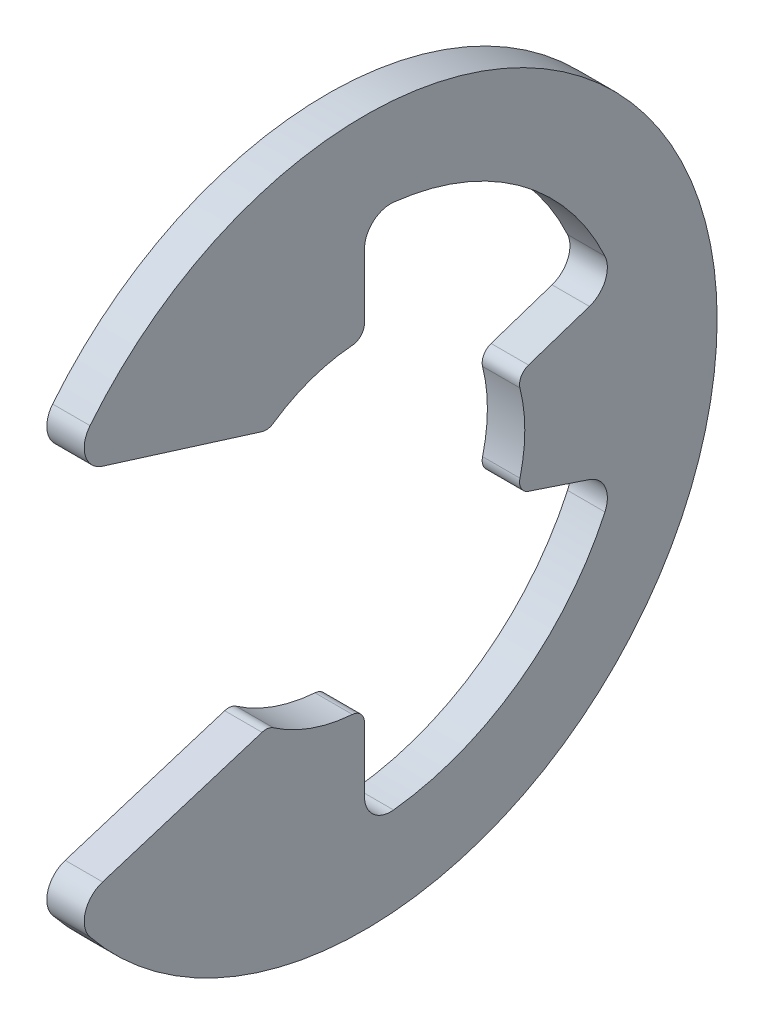
ISO-10303-21;
HEADER;
FILE_DESCRIPTION(('STEP AP214'),'2;1');
FILE_NAME('part.step','',(''),(''),'','','');
FILE_SCHEMA(('AUTOMOTIVE_DESIGN { 1 0 10303 214 1 1 1 1 }'));
ENDSEC;
DATA;
#1=APPLICATION_CONTEXT('core data for automotive mechanical design processes');
#2=APPLICATION_PROTOCOL_DEFINITION('international standard','automotive_design',2000,#1);
#3=PRODUCT_CONTEXT('',#1,'mechanical');
#4=PRODUCT('Part','Part','',(#3));
#5=PRODUCT_RELATED_PRODUCT_CATEGORY('part','',(#4));
#6=PRODUCT_DEFINITION_FORMATION('','',#4);
#7=PRODUCT_DEFINITION_CONTEXT('part definition',#1,'design');
#8=PRODUCT_DEFINITION('design','',#6,#7);
#9=PRODUCT_DEFINITION_SHAPE('','',#8);
#10=(LENGTH_UNIT() NAMED_UNIT(*) SI_UNIT(.MILLI.,.METRE.));
#11=(NAMED_UNIT(*) PLANE_ANGLE_UNIT() SI_UNIT($,.RADIAN.));
#12=(NAMED_UNIT(*) SI_UNIT($,.STERADIAN.) SOLID_ANGLE_UNIT());
#13=UNCERTAINTY_MEASURE_WITH_UNIT(LENGTH_MEASURE(1.E-05),#10,'distance_accuracy_value','');
#14=(GEOMETRIC_REPRESENTATION_CONTEXT(3) GLOBAL_UNCERTAINTY_ASSIGNED_CONTEXT((#13)) GLOBAL_UNIT_ASSIGNED_CONTEXT((#10,
#11,#12)) REPRESENTATION_CONTEXT('',''));
#15=CARTESIAN_POINT('',(0.,0.,0.));
#16=DIRECTION('',(0.,0.,1.));
#17=DIRECTION('',(1.,0.,0.));
#18=AXIS2_PLACEMENT_3D('',#15,#16,#17);
#19=CARTESIAN_POINT('',(0.444499999999999,0.,0.));
#20=DIRECTION('',(-1.,0.,0.));
#21=DIRECTION('',(0.,0.,1.));
#22=AXIS2_PLACEMENT_3D('',#19,#20,#21);
#23=CYLINDRICAL_SURFACE('',#22,3.81);
#24=CARTESIAN_POINT('',(0.444499999999999,0.,0.));
#25=DIRECTION('',(-1.,0.,0.));
#26=DIRECTION('',(0.,0.,-1.));
#27=AXIS2_PLACEMENT_3D('',#24,#25,#26);
#28=CIRCLE('',#27,3.81);
#29=CARTESIAN_POINT('',(0.444499999999999,0.928492622152132,-3.69513212897848));
#30=VERTEX_POINT('',#29);
#31=CARTESIAN_POINT('',(0.444499999999999,-0.928492622152131,-3.69513212897848));
#32=VERTEX_POINT('',#31);
#33=EDGE_CURVE('E246',#30,#32,#28,.T.);
#34=ORIENTED_EDGE('',*,*,#33,.F.);
#35=DIRECTION('',(-1.,0.,0.));
#36=VECTOR('',#35,1.);
#37=CARTESIAN_POINT('',(0.444499999999999,0.928492622152132,-3.69513212897848));
#38=LINE('',#37,#36);
#39=CARTESIAN_POINT('',(-0.444500000000001,0.928492622152132,-3.69513212897848));
#40=VERTEX_POINT('',#39);
#41=EDGE_CURVE('E360',#30,#40,#38,.T.);
#42=ORIENTED_EDGE('',*,*,#41,.T.);
#43=CARTESIAN_POINT('',(-0.444500000000001,0.,0.));
#44=DIRECTION('',(-1.,0.,0.));
#45=DIRECTION('',(0.,0.,-1.));
#46=AXIS2_PLACEMENT_3D('',#43,#44,#45);
#47=CIRCLE('',#46,3.81);
#48=CARTESIAN_POINT('',(-0.444500000000001,-0.928492622152131,-3.69513212897848));
#49=VERTEX_POINT('',#48);
#50=EDGE_CURVE('E419',#40,#49,#47,.T.);
#51=ORIENTED_EDGE('',*,*,#50,.T.);
#52=DIRECTION('',(-1.,0.,0.));
#53=VECTOR('',#52,1.);
#54=CARTESIAN_POINT('',(0.444499999999999,-0.928492622152131,-3.69513212897848));
#55=LINE('',#54,#53);
#56=EDGE_CURVE('E60',#49,#32,#55,.F.);
#57=ORIENTED_EDGE('',*,*,#56,.T.);
#58=EDGE_LOOP('',(#34,#42,#51,#57));
#59=FACE_BOUND('',#58,.T.);
#60=ADVANCED_FACE('F37',(#59),#23,.F.);
#61=CARTESIAN_POINT('',(0.444499999999999,-1.20482778852415,-3.61448336557246));
#62=DIRECTION('',(0.,0.948683298050514,-0.316227766016838));
#63=DIRECTION('',(0.,0.316227766016838,0.948683298050514));
#64=AXIS2_PLACEMENT_3D('',#61,#62,#63);
#65=PLANE('',#64);
#66=DIRECTION('',(0.,-0.316227766016838,-0.948683298050514));
#67=VECTOR('',#66,1.);
#68=CARTESIAN_POINT('',(0.444499999999999,-1.20482778852415,-3.61448336557246));
#69=LINE('',#68,#67);
#70=CARTESIAN_POINT('',(0.444499999999999,-1.29950232781631,-3.89850698344892));
#71=VERTEX_POINT('',#70);
#72=CARTESIAN_POINT('',(0.444499999999999,-1.78228945343254,-5.34686836029762));
#73=VERTEX_POINT('',#72);
#74=EDGE_CURVE('E248',#71,#73,#69,.T.);
#75=ORIENTED_EDGE('',*,*,#74,.F.);
#76=DIRECTION('',(-1.,0.,0.));
#77=VECTOR('',#76,1.);
#78=CARTESIAN_POINT('',(0.444499999999999,-1.29950232781631,-3.89850698344892));
#79=LINE('',#78,#77);
#80=CARTESIAN_POINT('',(-0.444500000000001,-1.29950232781631,-3.89850698344892));
#81=VERTEX_POINT('',#80);
#82=EDGE_CURVE('E365',#71,#81,#79,.T.);
#83=ORIENTED_EDGE('',*,*,#82,.T.);
#84=DIRECTION('',(0.,-0.316227766016838,-0.948683298050514));
#85=VECTOR('',#84,1.);
#86=CARTESIAN_POINT('',(-0.444500000000001,-1.20482778852415,-3.61448336557246));
#87=LINE('',#86,#85);
#88=CARTESIAN_POINT('',(-0.444500000000001,-1.78228945343254,-5.34686836029762));
#89=VERTEX_POINT('',#88);
#90=EDGE_CURVE('E421',#81,#89,#87,.T.);
#91=ORIENTED_EDGE('',*,*,#90,.T.);
#92=DIRECTION('',(1.,0.,0.));
#93=VECTOR('',#92,1.);
#94=CARTESIAN_POINT('',(0.444499999999999,-1.78228945343254,-5.34686836029762));
#95=LINE('',#94,#93);
#96=EDGE_CURVE('E294',#89,#73,#95,.T.);
#97=ORIENTED_EDGE('',*,*,#96,.T.);
#98=EDGE_LOOP('',(#75,#83,#91,#97));
#99=FACE_BOUND('',#98,.T.);
#100=ADVANCED_FACE('F457',(#99),#65,.F.);
#101=CARTESIAN_POINT('',(0.444499999999999,0.,0.));
#102=DIRECTION('',(-1.,0.,0.));
#103=DIRECTION('',(0.,0.,1.));
#104=AXIS2_PLACEMENT_3D('',#101,#102,#103);
#105=CYLINDRICAL_SURFACE('',#104,6.29264516129032);
#106=CARTESIAN_POINT('',(-0.444500000000001,0.,0.));
#107=DIRECTION('',(-1.,0.,0.));
#108=DIRECTION('',(0.,0.,-1.));
#109=AXIS2_PLACEMENT_3D('',#106,#107,#108);
#110=CIRCLE('',#109,6.29264516129032);
#111=CARTESIAN_POINT('',(-0.444500000000001,-2.63304543546507,-5.71528257050227));
#112=VERTEX_POINT('',#111);
#113=CARTESIAN_POINT('',(-0.444500000000001,-6.25463519415267,-0.690595188208944));
#114=VERTEX_POINT('',#113);
#115=EDGE_CURVE('E423',#112,#114,#110,.T.);
#116=ORIENTED_EDGE('',*,*,#115,.T.);
#117=DIRECTION('',(-1.,0.,0.));
#118=VECTOR('',#117,1.);
#119=CARTESIAN_POINT('',(0.444499999999999,-6.25463519415267,-0.690595188208944));
#120=LINE('',#119,#118);
#121=CARTESIAN_POINT('',(0.444499999999999,-6.25463519415267,-0.690595188208944));
#122=VERTEX_POINT('',#121);
#123=EDGE_CURVE('E292',#114,#122,#120,.F.);
#124=ORIENTED_EDGE('',*,*,#123,.T.);
#125=CARTESIAN_POINT('',(0.444499999999999,0.,0.));
#126=DIRECTION('',(-1.,0.,0.));
#127=DIRECTION('',(0.,0.,-1.));
#128=AXIS2_PLACEMENT_3D('',#125,#126,#127);
#129=CIRCLE('',#128,6.29264516129032);
#130=CARTESIAN_POINT('',(0.444499999999999,-2.63304543546507,-5.71528257050227));
#131=VERTEX_POINT('',#130);
#132=EDGE_CURVE('E250',#131,#122,#129,.T.);
#133=ORIENTED_EDGE('',*,*,#132,.F.);
#134=DIRECTION('',(-1.,0.,0.));
#135=VECTOR('',#134,1.);
#136=CARTESIAN_POINT('',(0.444499999999999,-2.63304543546507,-5.71528257050227));
#137=LINE('',#136,#135);
#138=EDGE_CURVE('E289',#131,#112,#137,.T.);
#139=ORIENTED_EDGE('',*,*,#138,.T.);
#140=EDGE_LOOP('',(#116,#124,#133,#139));
#141=FACE_BOUND('',#140,.T.);
#142=ADVANCED_FACE('F463',(#141),#105,.F.);
#143=CARTESIAN_POINT('',(0.444499999999999,-6.29264516129032,0.));
#144=DIRECTION('',(0.,0.,1.));
#145=DIRECTION('',(0.,-1.,0.));
#146=AXIS2_PLACEMENT_3D('',#143,#144,#145);
#147=PLANE('',#146);
#148=DIRECTION('',(0.,1.,0.));
#149=VECTOR('',#148,1.);
#150=CARTESIAN_POINT('',(-0.444500000000001,-6.29264516129032,0.));
#151=LINE('',#150,#149);
#152=CARTESIAN_POINT('',(-0.444500000000001,-5.63609412254343,0.));
#153=VERTEX_POINT('',#152);
#154=CARTESIAN_POINT('',(-0.444500000000001,-4.10938718059031,0.));
#155=VERTEX_POINT('',#154);
#156=EDGE_CURVE('E428',#153,#155,#151,.T.);
#157=ORIENTED_EDGE('',*,*,#156,.T.);
#158=DIRECTION('',(-1.,0.,0.));
#159=VECTOR('',#158,1.);
#160=CARTESIAN_POINT('',(0.444499999999999,-4.10938718059031,0.));
#161=LINE('',#160,#159);
#162=CARTESIAN_POINT('',(0.444499999999999,-4.10938718059031,0.));
#163=VERTEX_POINT('',#162);
#164=EDGE_CURVE('E343',#155,#163,#161,.F.);
#165=ORIENTED_EDGE('',*,*,#164,.T.);
#166=DIRECTION('',(0.,1.,0.));
#167=VECTOR('',#166,1.);
#168=CARTESIAN_POINT('',(0.444499999999999,-6.29264516129032,0.));
#169=LINE('',#168,#167);
#170=CARTESIAN_POINT('',(0.444499999999999,-5.63609412254343,0.));
#171=VERTEX_POINT('',#170);
#172=EDGE_CURVE('E253',#171,#163,#169,.T.);
#173=ORIENTED_EDGE('',*,*,#172,.F.);
#174=DIRECTION('',(1.,0.,0.));
#175=VECTOR('',#174,1.);
#176=CARTESIAN_POINT('',(-0.444500000000001,-5.63609412254343,0.));
#177=LINE('',#176,#175);
#178=EDGE_CURVE('E286',#171,#153,#177,.F.);
#179=ORIENTED_EDGE('',*,*,#178,.T.);
#180=EDGE_LOOP('',(#157,#165,#173,#179));
#181=FACE_BOUND('',#180,.T.);
#182=ADVANCED_FACE('F469',(#181),#147,.F.);
#183=CARTESIAN_POINT('',(0.444499999999999,0.,0.));
#184=DIRECTION('',(-1.,0.,0.));
#185=DIRECTION('',(0.,0.,1.));
#186=AXIS2_PLACEMENT_3D('',#183,#184,#185);
#187=CYLINDRICAL_SURFACE('',#186,3.81);
#188=CARTESIAN_POINT('',(0.444499999999999,0.,0.));
#189=DIRECTION('',(-1.,0.,0.));
#190=DIRECTION('',(0.,0.,-1.));
#191=AXIS2_PLACEMENT_3D('',#188,#189,#190);
#192=CIRCLE('',#191,3.81);
#193=CARTESIAN_POINT('',(0.444499999999999,-3.79912528251801,0.287657935285054));
#194=VERTEX_POINT('',#193);
#195=CARTESIAN_POINT('',(0.444499999999999,-3.1352778512518,2.16474774406856));
#196=VERTEX_POINT('',#195);
#197=EDGE_CURVE('E256',#194,#196,#192,.T.);
#198=ORIENTED_EDGE('',*,*,#197,.F.);
#199=DIRECTION('',(-1.,0.,0.));
#200=VECTOR('',#199,1.);
#201=CARTESIAN_POINT('',(0.444499999999999,-3.79912528251801,0.287657935285054));
#202=LINE('',#201,#200);
#203=CARTESIAN_POINT('',(-0.444500000000001,-3.79912528251801,0.287657935285054));
#204=VERTEX_POINT('',#203);
#205=EDGE_CURVE('E328',#194,#204,#202,.T.);
#206=ORIENTED_EDGE('',*,*,#205,.T.);
#207=CARTESIAN_POINT('',(-0.444500000000001,0.,0.));
#208=DIRECTION('',(-1.,0.,0.));
#209=DIRECTION('',(0.,0.,-1.));
#210=AXIS2_PLACEMENT_3D('',#207,#208,#209);
#211=CIRCLE('',#210,3.81);
#212=CARTESIAN_POINT('',(-0.444500000000001,-3.1352778512518,2.16474774406856));
#213=VERTEX_POINT('',#212);
#214=EDGE_CURVE('E232',#204,#213,#211,.T.);
#215=ORIENTED_EDGE('',*,*,#214,.T.);
#216=DIRECTION('',(-1.,0.,0.));
#217=VECTOR('',#216,1.);
#218=CARTESIAN_POINT('',(0.444499999999999,-3.1352778512518,2.16474774406856));
#219=LINE('',#218,#217);
#220=EDGE_CURVE('E326',#213,#196,#219,.F.);
#221=ORIENTED_EDGE('',*,*,#220,.T.);
#222=EDGE_LOOP('',(#198,#206,#215,#221));
#223=FACE_BOUND('',#222,.T.);
#224=ADVANCED_FACE('F434',(#223),#187,.F.);
#225=CARTESIAN_POINT('',(0.444499999999999,-3.048,2.286));
#226=DIRECTION('',(0.,-0.954513538836348,-0.29816757734219));
#227=DIRECTION('',(0.,0.29816757734219,-0.954513538836348));
#228=AXIS2_PLACEMENT_3D('',#225,#226,#227);
#229=PLANE('',#228);
#230=DIRECTION('',(0.,-0.29816757734219,0.954513538836348));
#231=VECTOR('',#230,1.);
#232=CARTESIAN_POINT('',(0.444499999999999,-3.048,2.286));
#233=LINE('',#232,#231);
#234=CARTESIAN_POINT('',(0.444499999999999,-3.09432865482843,2.43431031819085));
#235=VERTEX_POINT('',#234);
#236=CARTESIAN_POINT('',(0.444499999999999,-4.27839448098877,6.22481923944225));
#237=VERTEX_POINT('',#236);
#238=EDGE_CURVE('E259',#235,#237,#233,.T.);
#239=ORIENTED_EDGE('',*,*,#238,.F.);
#240=DIRECTION('',(-1.,0.,0.));
#241=VECTOR('',#240,1.);
#242=CARTESIAN_POINT('',(0.444499999999999,-3.09432865482843,2.43431031819085));
#243=LINE('',#242,#241);
#244=CARTESIAN_POINT('',(-0.444500000000001,-3.09432865482843,2.43431031819085));
#245=VERTEX_POINT('',#244);
#246=EDGE_CURVE('E356',#235,#245,#243,.T.);
#247=ORIENTED_EDGE('',*,*,#246,.T.);
#248=DIRECTION('',(0.,-0.29816757734219,0.954513538836348));
#249=VECTOR('',#248,1.);
#250=CARTESIAN_POINT('',(-0.444500000000001,-3.048,2.286));
#251=LINE('',#250,#249);
#252=CARTESIAN_POINT('',(-0.444500000000001,-4.27839448098877,6.22481923944225));
#253=VERTEX_POINT('',#252);
#254=EDGE_CURVE('E227',#245,#253,#251,.T.);
#255=ORIENTED_EDGE('',*,*,#254,.T.);
#256=DIRECTION('',(-1.,0.,0.));
#257=VECTOR('',#256,1.);
#258=CARTESIAN_POINT('',(0.444499999999999,-4.27839448098877,6.22481923944225));
#259=LINE('',#258,#257);
#260=EDGE_CURVE('E207',#253,#237,#259,.F.);
#261=ORIENTED_EDGE('',*,*,#260,.T.);
#262=EDGE_LOOP('',(#239,#247,#255,#261));
#263=FACE_BOUND('',#262,.T.);
#264=ADVANCED_FACE('F442',(#263),#229,.F.);
#265=CARTESIAN_POINT('',(0.444499999999999,0.,0.));
#266=DIRECTION('',(-1.,0.,0.));
#267=DIRECTION('',(0.,0.,1.));
#268=AXIS2_PLACEMENT_3D('',#265,#266,#267);
#269=CYLINDRICAL_SURFACE('',#268,8.382);
#270=CARTESIAN_POINT('',(0.444499999999999,0.,0.));
#271=DIRECTION('',(1.,0.,0.));
#272=DIRECTION('',(0.,0.,-1.));
#273=AXIS2_PLACEMENT_3D('',#270,#271,#272);
#274=CIRCLE('',#273,8.382);
#275=CARTESIAN_POINT('',(0.444499999999999,-5.2631362505669,6.52359722913429));
#276=VERTEX_POINT('',#275);
#277=CARTESIAN_POINT('',(0.444499999999999,5.2631362505669,6.5235972291343));
#278=VERTEX_POINT('',#277);
#279=EDGE_CURVE('E220',#276,#278,#274,.T.);
#280=ORIENTED_EDGE('',*,*,#279,.F.);
#281=DIRECTION('',(-1.,0.,0.));
#282=VECTOR('',#281,1.);
#283=CARTESIAN_POINT('',(0.444499999999999,-5.2631362505669,6.52359722913429));
#284=LINE('',#283,#282);
#285=CARTESIAN_POINT('',(-0.444500000000001,-5.2631362505669,6.52359722913429));
#286=VERTEX_POINT('',#285);
#287=EDGE_CURVE('E205',#276,#286,#284,.T.);
#288=ORIENTED_EDGE('',*,*,#287,.T.);
#289=CARTESIAN_POINT('',(-0.444500000000001,0.,0.));
#290=DIRECTION('',(1.,0.,0.));
#291=DIRECTION('',(0.,0.,-1.));
#292=AXIS2_PLACEMENT_3D('',#289,#290,#291);
#293=CIRCLE('',#292,8.382);
#294=CARTESIAN_POINT('',(-0.444500000000001,5.2631362505669,6.5235972291343));
#295=VERTEX_POINT('',#294);
#296=EDGE_CURVE('E217',#286,#295,#293,.T.);
#297=ORIENTED_EDGE('',*,*,#296,.T.);
#298=DIRECTION('',(-1.,0.,0.));
#299=VECTOR('',#298,1.);
#300=CARTESIAN_POINT('',(0.444499999999999,5.2631362505669,6.52359722913429));
#301=LINE('',#300,#299);
#302=EDGE_CURVE('E221',#295,#278,#301,.F.);
#303=ORIENTED_EDGE('',*,*,#302,.T.);
#304=EDGE_LOOP('',(#280,#288,#297,#303));
#305=FACE_BOUND('',#304,.T.);
#306=ADVANCED_FACE('F216',(#305),#269,.T.);
#307=CARTESIAN_POINT('',(0.444499999999999,4.5357679010237,7.04873985532471));
#308=DIRECTION('',(0.,0.954513538836348,-0.29816757734219));
#309=DIRECTION('',(0.,0.29816757734219,0.954513538836348));
#310=AXIS2_PLACEMENT_3D('',#307,#308,#309);
#311=PLANE('',#310);
#312=DIRECTION('',(0.,-0.29816757734219,-0.954513538836348));
#313=VECTOR('',#312,1.);
#314=CARTESIAN_POINT('',(-0.444500000000001,4.5357679010237,7.04873985532471));
#315=LINE('',#314,#313);
#316=CARTESIAN_POINT('',(-0.444500000000001,4.27839448098877,6.22481923944225));
#317=VERTEX_POINT('',#316);
#318=CARTESIAN_POINT('',(-0.444500000000001,3.09432865482843,2.43431031819084));
#319=VERTEX_POINT('',#318);
#320=EDGE_CURVE('E226',#317,#319,#315,.T.);
#321=ORIENTED_EDGE('',*,*,#320,.T.);
#322=DIRECTION('',(-1.,0.,0.));
#323=VECTOR('',#322,1.);
#324=CARTESIAN_POINT('',(0.444499999999999,3.09432865482843,2.43431031819084));
#325=LINE('',#324,#323);
#326=CARTESIAN_POINT('',(0.444499999999999,3.09432865482843,2.43431031819084));
#327=VERTEX_POINT('',#326);
#328=EDGE_CURVE('E45',#319,#327,#325,.F.);
#329=ORIENTED_EDGE('',*,*,#328,.T.);
#330=DIRECTION('',(0.,-0.29816757734219,-0.954513538836348));
#331=VECTOR('',#330,1.);
#332=CARTESIAN_POINT('',(0.444499999999999,4.5357679010237,7.04873985532471));
#333=LINE('',#332,#331);
#334=CARTESIAN_POINT('',(0.444499999999999,4.27839448098877,6.22481923944225));
#335=VERTEX_POINT('',#334);
#336=EDGE_CURVE('E262',#335,#327,#333,.T.);
#337=ORIENTED_EDGE('',*,*,#336,.F.);
#338=DIRECTION('',(-1.,0.,0.));
#339=VECTOR('',#338,1.);
#340=CARTESIAN_POINT('',(0.444499999999999,4.27839448098877,6.22481923944225));
#341=LINE('',#340,#339);
#342=EDGE_CURVE('E283',#335,#317,#341,.T.);
#343=ORIENTED_EDGE('',*,*,#342,.T.);
#344=EDGE_LOOP('',(#321,#329,#337,#343));
#345=FACE_BOUND('',#344,.T.);
#346=ADVANCED_FACE('F375',(#345),#311,.F.);
#347=CARTESIAN_POINT('',(0.444499999999999,0.,0.));
#348=DIRECTION('',(-1.,0.,0.));
#349=DIRECTION('',(0.,0.,1.));
#350=AXIS2_PLACEMENT_3D('',#347,#348,#349);
#351=CYLINDRICAL_SURFACE('',#350,3.81);
#352=CARTESIAN_POINT('',(0.444499999999999,0.,0.));
#353=DIRECTION('',(-1.,0.,0.));
#354=DIRECTION('',(0.,0.,-1.));
#355=AXIS2_PLACEMENT_3D('',#352,#353,#354);
#356=CIRCLE('',#355,3.81);
#357=CARTESIAN_POINT('',(0.444499999999999,3.1352778512518,2.16474774406856));
#358=VERTEX_POINT('',#357);
#359=CARTESIAN_POINT('',(0.444499999999999,3.79912528251801,0.287657935285055));
#360=VERTEX_POINT('',#359);
#361=EDGE_CURVE('E265',#358,#360,#356,.T.);
#362=ORIENTED_EDGE('',*,*,#361,.F.);
#363=DIRECTION('',(-1.,0.,0.));
#364=VECTOR('',#363,1.);
#365=CARTESIAN_POINT('',(0.444499999999999,3.1352778512518,2.16474774406856));
#366=LINE('',#365,#364);
#367=CARTESIAN_POINT('',(-0.444500000000001,3.1352778512518,2.16474774406856));
#368=VERTEX_POINT('',#367);
#369=EDGE_CURVE('E370',#358,#368,#366,.T.);
#370=ORIENTED_EDGE('',*,*,#369,.T.);
#371=CARTESIAN_POINT('',(-0.444500000000001,0.,0.));
#372=DIRECTION('',(-1.,0.,0.));
#373=DIRECTION('',(0.,0.,-1.));
#374=AXIS2_PLACEMENT_3D('',#371,#372,#373);
#375=CIRCLE('',#374,3.81);
#376=CARTESIAN_POINT('',(-0.444500000000001,3.79912528251801,0.287657935285055));
#377=VERTEX_POINT('',#376);
#378=EDGE_CURVE('E230',#368,#377,#375,.T.);
#379=ORIENTED_EDGE('',*,*,#378,.T.);
#380=DIRECTION('',(-1.,0.,0.));
#381=VECTOR('',#380,1.);
#382=CARTESIAN_POINT('',(0.444499999999999,3.79912528251801,0.287657935285055));
#383=LINE('',#382,#381);
#384=EDGE_CURVE('E368',#377,#360,#383,.F.);
#385=ORIENTED_EDGE('',*,*,#384,.T.);
#386=EDGE_LOOP('',(#362,#370,#379,#385));
#387=FACE_BOUND('',#386,.T.);
#388=ADVANCED_FACE('F386',(#387),#351,.F.);
#389=CARTESIAN_POINT('',(0.444499999999999,3.81,0.));
#390=DIRECTION('',(0.,0.,1.));
#391=DIRECTION('',(0.,-1.,0.));
#392=AXIS2_PLACEMENT_3D('',#389,#390,#391);
#393=PLANE('',#392);
#394=DIRECTION('',(0.,1.,0.));
#395=VECTOR('',#394,1.);
#396=CARTESIAN_POINT('',(0.444499999999999,3.81,0.));
#397=LINE('',#396,#395);
#398=CARTESIAN_POINT('',(0.444499999999999,4.10938718059031,0.));
#399=VERTEX_POINT('',#398);
#400=CARTESIAN_POINT('',(0.444499999999999,5.63609412254343,0.));
#401=VERTEX_POINT('',#400);
#402=EDGE_CURVE('E268',#399,#401,#397,.T.);
#403=ORIENTED_EDGE('',*,*,#402,.F.);
#404=DIRECTION('',(-1.,0.,0.));
#405=VECTOR('',#404,1.);
#406=CARTESIAN_POINT('',(0.444499999999999,4.10938718059031,0.));
#407=LINE('',#406,#405);
#408=CARTESIAN_POINT('',(-0.444500000000001,4.10938718059031,0.));
#409=VERTEX_POINT('',#408);
#410=EDGE_CURVE('E11',#399,#409,#407,.T.);
#411=ORIENTED_EDGE('',*,*,#410,.T.);
#412=DIRECTION('',(0.,1.,0.));
#413=VECTOR('',#412,1.);
#414=CARTESIAN_POINT('',(-0.444500000000001,3.81,0.));
#415=LINE('',#414,#413);
#416=CARTESIAN_POINT('',(-0.444500000000001,5.63609412254343,0.));
#417=VERTEX_POINT('',#416);
#418=EDGE_CURVE('E238',#409,#417,#415,.T.);
#419=ORIENTED_EDGE('',*,*,#418,.T.);
#420=DIRECTION('',(1.,0.,0.));
#421=VECTOR('',#420,1.);
#422=CARTESIAN_POINT('',(0.444499999999999,5.63609412254343,0.));
#423=LINE('',#422,#421);
#424=EDGE_CURVE('E305',#417,#401,#423,.T.);
#425=ORIENTED_EDGE('',*,*,#424,.T.);
#426=EDGE_LOOP('',(#403,#411,#419,#425));
#427=FACE_BOUND('',#426,.T.);
#428=ADVANCED_FACE('F394',(#427),#393,.F.);
#429=CARTESIAN_POINT('',(0.444499999999999,0.,0.));
#430=DIRECTION('',(-1.,0.,0.));
#431=DIRECTION('',(0.,0.,1.));
#432=AXIS2_PLACEMENT_3D('',#429,#430,#431);
#433=CYLINDRICAL_SURFACE('',#432,6.29264516129032);
#434=CARTESIAN_POINT('',(-0.444500000000001,0.,0.));
#435=DIRECTION('',(-1.,0.,0.));
#436=DIRECTION('',(0.,0.,-1.));
#437=AXIS2_PLACEMENT_3D('',#434,#435,#436);
#438=CIRCLE('',#437,6.29264516129032);
#439=CARTESIAN_POINT('',(-0.444500000000001,6.25463519415267,-0.690595188208943));
#440=VERTEX_POINT('',#439);
#441=CARTESIAN_POINT('',(-0.444500000000001,2.63304543546507,-5.71528257050227));
#442=VERTEX_POINT('',#441);
#443=EDGE_CURVE('E240',#440,#442,#438,.T.);
#444=ORIENTED_EDGE('',*,*,#443,.T.);
#445=DIRECTION('',(-1.,0.,0.));
#446=VECTOR('',#445,1.);
#447=CARTESIAN_POINT('',(0.444499999999999,2.63304543546507,-5.71528257050227));
#448=LINE('',#447,#446);
#449=CARTESIAN_POINT('',(0.444499999999999,2.63304543546507,-5.71528257050227));
#450=VERTEX_POINT('',#449);
#451=EDGE_CURVE('E303',#442,#450,#448,.F.);
#452=ORIENTED_EDGE('',*,*,#451,.T.);
#453=CARTESIAN_POINT('',(0.444499999999999,0.,0.));
#454=DIRECTION('',(-1.,0.,0.));
#455=DIRECTION('',(0.,0.,-1.));
#456=AXIS2_PLACEMENT_3D('',#453,#454,#455);
#457=CIRCLE('',#456,6.29264516129032);
#458=CARTESIAN_POINT('',(0.444499999999999,6.25463519415267,-0.690595188208943));
#459=VERTEX_POINT('',#458);
#460=EDGE_CURVE('E270',#459,#450,#457,.T.);
#461=ORIENTED_EDGE('',*,*,#460,.F.);
#462=DIRECTION('',(-1.,0.,0.));
#463=VECTOR('',#462,1.);
#464=CARTESIAN_POINT('',(0.444499999999999,6.25463519415267,-0.690595188208943));
#465=LINE('',#464,#463);
#466=EDGE_CURVE('E300',#459,#440,#465,.T.);
#467=ORIENTED_EDGE('',*,*,#466,.T.);
#468=EDGE_LOOP('',(#444,#452,#461,#467));
#469=FACE_BOUND('',#468,.T.);
#470=ADVANCED_FACE('F402',(#469),#433,.F.);
#471=CARTESIAN_POINT('',(0.444499999999999,1.9899091216915,-5.96972736507451));
#472=DIRECTION('',(0.,-0.948683298050514,-0.316227766016838));
#473=DIRECTION('',(0.,0.316227766016838,-0.948683298050514));
#474=AXIS2_PLACEMENT_3D('',#471,#472,#473);
#475=PLANE('',#474);
#476=DIRECTION('',(0.,-0.316227766016838,0.948683298050514));
#477=VECTOR('',#476,1.);
#478=CARTESIAN_POINT('',(-0.444500000000001,1.9899091216915,-5.96972736507451));
#479=LINE('',#478,#477);
#480=CARTESIAN_POINT('',(-0.444500000000001,1.78228945343254,-5.34686836029761));
#481=VERTEX_POINT('',#480);
#482=CARTESIAN_POINT('',(-0.444500000000001,1.29950232781631,-3.89850698344892));
#483=VERTEX_POINT('',#482);
#484=EDGE_CURVE('E243',#481,#483,#479,.T.);
#485=ORIENTED_EDGE('',*,*,#484,.T.);
#486=DIRECTION('',(-1.,0.,0.));
#487=VECTOR('',#486,1.);
#488=CARTESIAN_POINT('',(0.444499999999999,1.29950232781631,-3.89850698344892));
#489=LINE('',#488,#487);
#490=CARTESIAN_POINT('',(0.444499999999999,1.29950232781631,-3.89850698344892));
#491=VERTEX_POINT('',#490);
#492=EDGE_CURVE('E363',#483,#491,#489,.F.);
#493=ORIENTED_EDGE('',*,*,#492,.T.);
#494=DIRECTION('',(0.,-0.316227766016838,0.948683298050514));
#495=VECTOR('',#494,1.);
#496=CARTESIAN_POINT('',(0.444499999999999,1.9899091216915,-5.96972736507451));
#497=LINE('',#496,#495);
#498=CARTESIAN_POINT('',(0.444499999999999,1.78228945343254,-5.34686836029761));
#499=VERTEX_POINT('',#498);
#500=EDGE_CURVE('E273',#499,#491,#497,.T.);
#501=ORIENTED_EDGE('',*,*,#500,.F.);
#502=DIRECTION('',(1.,0.,0.));
#503=VECTOR('',#502,1.);
#504=CARTESIAN_POINT('',(-0.444500000000001,1.78228945343254,-5.34686836029761));
#505=LINE('',#504,#503);
#506=EDGE_CURVE('E297',#499,#481,#505,.F.);
#507=ORIENTED_EDGE('',*,*,#506,.T.);
#508=EDGE_LOOP('',(#485,#493,#501,#507));
#509=FACE_BOUND('',#508,.T.);
#510=ADVANCED_FACE('F413',(#509),#475,.F.);
#511=CARTESIAN_POINT('',(0.444499999999999,0.,0.));
#512=DIRECTION('',(1.,0.,0.));
#513=DIRECTION('',(0.,0.,-1.));
#514=AXIS2_PLACEMENT_3D('',#511,#512,#513);
#515=PLANE('',#514);
#516=ORIENTED_EDGE('',*,*,#172,.T.);
#517=CARTESIAN_POINT('',(0.444499999999999,-4.10938718059031,0.31115));
#518=DIRECTION('',(1.,0.,0.));
#519=DIRECTION('',(0.,0.,-1.));
#520=AXIS2_PLACEMENT_3D('',#517,#518,#519);
#521=CIRCLE('',#520,0.31115);
#522=EDGE_CURVE('E354',#163,#194,#521,.T.);
#523=ORIENTED_EDGE('',*,*,#522,.T.);
#524=ORIENTED_EDGE('',*,*,#197,.T.);
#525=CARTESIAN_POINT('',(0.444499999999999,-3.39132554243736,2.34153547650082));
#526=DIRECTION('',(1.,0.,0.));
#527=DIRECTION('',(0.,0.,-1.));
#528=AXIS2_PLACEMENT_3D('',#525,#526,#527);
#529=CIRCLE('',#528,0.31115);
#530=EDGE_CURVE('E352',#196,#235,#529,.T.);
#531=ORIENTED_EDGE('',*,*,#530,.T.);
#532=ORIENTED_EDGE('',*,*,#238,.T.);
#533=CARTESIAN_POINT('',(0.444499999999999,-4.87238825620663,6.0392695560622));
#534=DIRECTION('',(1.,0.,0.));
#535=DIRECTION('',(0.,0.,-1.));
#536=AXIS2_PLACEMENT_3D('',#533,#534,#535);
#537=CIRCLE('',#536,0.6223);
#538=EDGE_CURVE('E281',#237,#276,#537,.T.);
#539=ORIENTED_EDGE('',*,*,#538,.T.);
#540=ORIENTED_EDGE('',*,*,#279,.T.);
#541=CARTESIAN_POINT('',(0.444499999999999,4.87238825620663,6.0392695560622));
#542=DIRECTION('',(1.,0.,0.));
#543=DIRECTION('',(0.,0.,-1.));
#544=AXIS2_PLACEMENT_3D('',#541,#542,#543);
#545=CIRCLE('',#544,0.6223);
#546=EDGE_CURVE('E279',#278,#335,#545,.T.);
#547=ORIENTED_EDGE('',*,*,#546,.T.);
#548=ORIENTED_EDGE('',*,*,#336,.T.);
#549=CARTESIAN_POINT('',(0.444499999999999,3.39132554243736,2.34153547650082));
#550=DIRECTION('',(1.,0.,0.));
#551=DIRECTION('',(0.,0.,-1.));
#552=AXIS2_PLACEMENT_3D('',#549,#550,#551);
#553=CIRCLE('',#552,0.31115);
#554=EDGE_CURVE('E347',#327,#358,#553,.T.);
#555=ORIENTED_EDGE('',*,*,#554,.T.);
#556=ORIENTED_EDGE('',*,*,#361,.T.);
#557=CARTESIAN_POINT('',(0.444499999999999,4.10938718059031,0.311150000000001));
#558=DIRECTION('',(1.,0.,0.));
#559=DIRECTION('',(0.,0.,-1.));
#560=AXIS2_PLACEMENT_3D('',#557,#558,#559);
#561=CIRCLE('',#560,0.31115);
#562=EDGE_CURVE('E345',#360,#399,#561,.T.);
#563=ORIENTED_EDGE('',*,*,#562,.T.);
#564=ORIENTED_EDGE('',*,*,#402,.T.);
#565=CARTESIAN_POINT('',(0.444499999999999,5.63609412254343,-0.622299999999999));
#566=DIRECTION('',(1.,0.,0.));
#567=DIRECTION('',(0.,0.,-1.));
#568=AXIS2_PLACEMENT_3D('',#565,#566,#567);
#569=CIRCLE('',#568,0.6223);
#570=EDGE_CURVE('E324',#401,#459,#569,.F.);
#571=ORIENTED_EDGE('',*,*,#570,.T.);
#572=ORIENTED_EDGE('',*,*,#460,.T.);
#573=CARTESIAN_POINT('',(0.444499999999999,2.37265506980937,-5.15007982150534));
#574=DIRECTION('',(1.,0.,0.));
#575=DIRECTION('',(0.,0.,-1.));
#576=AXIS2_PLACEMENT_3D('',#573,#574,#575);
#577=CIRCLE('',#576,0.6223);
#578=EDGE_CURVE('E319',#450,#499,#577,.F.);
#579=ORIENTED_EDGE('',*,*,#578,.T.);
#580=ORIENTED_EDGE('',*,*,#500,.T.);
#581=CARTESIAN_POINT('',(0.444499999999999,1.00431951962789,-3.99690125284506));
#582=DIRECTION('',(1.,0.,0.));
#583=DIRECTION('',(0.,0.,-1.));
#584=AXIS2_PLACEMENT_3D('',#581,#582,#583);
#585=CIRCLE('',#584,0.31115);
#586=EDGE_CURVE('E350',#491,#30,#585,.T.);
#587=ORIENTED_EDGE('',*,*,#586,.T.);
#588=ORIENTED_EDGE('',*,*,#33,.T.);
#589=CARTESIAN_POINT('',(0.444499999999999,-1.00431951962789,-3.99690125284506));
#590=DIRECTION('',(1.,0.,0.));
#591=DIRECTION('',(0.,0.,-1.));
#592=AXIS2_PLACEMENT_3D('',#589,#590,#591);
#593=CIRCLE('',#592,0.31115);
#594=EDGE_CURVE('E52',#32,#71,#593,.T.);
#595=ORIENTED_EDGE('',*,*,#594,.T.);
#596=ORIENTED_EDGE('',*,*,#74,.T.);
#597=CARTESIAN_POINT('',(0.444499999999999,-2.37265506980937,-5.15007982150534));
#598=DIRECTION('',(1.,0.,0.));
#599=DIRECTION('',(0.,0.,-1.));
#600=AXIS2_PLACEMENT_3D('',#597,#598,#599);
#601=CIRCLE('',#600,0.6223);
#602=EDGE_CURVE('E315',#73,#131,#601,.F.);
#603=ORIENTED_EDGE('',*,*,#602,.T.);
#604=ORIENTED_EDGE('',*,*,#132,.T.);
#605=CARTESIAN_POINT('',(0.444499999999999,-5.63609412254343,-0.622299999999999));
#606=DIRECTION('',(1.,0.,0.));
#607=DIRECTION('',(0.,0.,-1.));
#608=AXIS2_PLACEMENT_3D('',#605,#606,#607);
#609=CIRCLE('',#608,0.6223);
#610=EDGE_CURVE('E310',#122,#171,#609,.F.);
#611=ORIENTED_EDGE('',*,*,#610,.T.);
#612=EDGE_LOOP('',(#516,#523,#524,#531,#532,#539,#540,#547,#548,#555,#556,#563,#564,#571,#572,
#579,#580,#587,#588,#595,#596,#603,#604,#611));
#613=FACE_BOUND('',#612,.T.);
#614=ADVANCED_FACE('F379',(#613),#515,.T.);
#615=CARTESIAN_POINT('',(-0.444500000000001,0.,0.));
#616=DIRECTION('',(1.,0.,0.));
#617=DIRECTION('',(0.,0.,-1.));
#618=AXIS2_PLACEMENT_3D('',#615,#616,#617);
#619=PLANE('',#618);
#620=ORIENTED_EDGE('',*,*,#214,.F.);
#621=CARTESIAN_POINT('',(-0.444500000000001,-4.10938718059031,0.31115));
#622=DIRECTION('',(1.,0.,0.));
#623=DIRECTION('',(0.,0.,-1.));
#624=AXIS2_PLACEMENT_3D('',#621,#622,#623);
#625=CIRCLE('',#624,0.31115);
#626=EDGE_CURVE('E341',#204,#155,#625,.F.);
#627=ORIENTED_EDGE('',*,*,#626,.T.);
#628=ORIENTED_EDGE('',*,*,#156,.F.);
#629=CARTESIAN_POINT('',(-0.444500000000001,-5.63609412254343,-0.622299999999999));
#630=DIRECTION('',(1.,0.,0.));
#631=DIRECTION('',(0.,0.,-1.));
#632=AXIS2_PLACEMENT_3D('',#629,#630,#631);
#633=CIRCLE('',#632,0.6223);
#634=EDGE_CURVE('E308',#153,#114,#633,.T.);
#635=ORIENTED_EDGE('',*,*,#634,.T.);
#636=ORIENTED_EDGE('',*,*,#115,.F.);
#637=CARTESIAN_POINT('',(-0.444500000000001,-2.37265506980937,-5.15007982150534));
#638=DIRECTION('',(1.,0.,0.));
#639=DIRECTION('',(0.,0.,-1.));
#640=AXIS2_PLACEMENT_3D('',#637,#638,#639);
#641=CIRCLE('',#640,0.6223);
#642=EDGE_CURVE('E312',#112,#89,#641,.T.);
#643=ORIENTED_EDGE('',*,*,#642,.T.);
#644=ORIENTED_EDGE('',*,*,#90,.F.);
#645=CARTESIAN_POINT('',(-0.444500000000001,-1.00431951962789,-3.99690125284506));
#646=DIRECTION('',(1.,0.,0.));
#647=DIRECTION('',(0.,0.,-1.));
#648=AXIS2_PLACEMENT_3D('',#645,#646,#647);
#649=CIRCLE('',#648,0.31115);
#650=EDGE_CURVE('E335',#81,#49,#649,.F.);
#651=ORIENTED_EDGE('',*,*,#650,.T.);
#652=ORIENTED_EDGE('',*,*,#50,.F.);
#653=CARTESIAN_POINT('',(-0.444500000000001,1.00431951962789,-3.99690125284506));
#654=DIRECTION('',(1.,0.,0.));
#655=DIRECTION('',(0.,0.,-1.));
#656=AXIS2_PLACEMENT_3D('',#653,#654,#655);
#657=CIRCLE('',#656,0.31115);
#658=EDGE_CURVE('E337',#40,#483,#657,.F.);
#659=ORIENTED_EDGE('',*,*,#658,.T.);
#660=ORIENTED_EDGE('',*,*,#484,.F.);
#661=CARTESIAN_POINT('',(-0.444500000000001,2.37265506980937,-5.15007982150534));
#662=DIRECTION('',(1.,0.,0.));
#663=DIRECTION('',(0.,0.,-1.));
#664=AXIS2_PLACEMENT_3D('',#661,#662,#663);
#665=CIRCLE('',#664,0.6223);
#666=EDGE_CURVE('E317',#481,#442,#665,.T.);
#667=ORIENTED_EDGE('',*,*,#666,.T.);
#668=ORIENTED_EDGE('',*,*,#443,.F.);
#669=CARTESIAN_POINT('',(-0.444500000000001,5.63609412254343,-0.622299999999999));
#670=DIRECTION('',(1.,0.,0.));
#671=DIRECTION('',(0.,0.,-1.));
#672=AXIS2_PLACEMENT_3D('',#669,#670,#671);
#673=CIRCLE('',#672,0.6223);
#674=EDGE_CURVE('E321',#440,#417,#673,.T.);
#675=ORIENTED_EDGE('',*,*,#674,.T.);
#676=ORIENTED_EDGE('',*,*,#418,.F.);
#677=CARTESIAN_POINT('',(-0.444500000000001,4.10938718059031,0.311150000000001));
#678=DIRECTION('',(1.,0.,0.));
#679=DIRECTION('',(0.,0.,-1.));
#680=AXIS2_PLACEMENT_3D('',#677,#678,#679);
#681=CIRCLE('',#680,0.31115);
#682=EDGE_CURVE('E331',#409,#377,#681,.F.);
#683=ORIENTED_EDGE('',*,*,#682,.T.);
#684=ORIENTED_EDGE('',*,*,#378,.F.);
#685=CARTESIAN_POINT('',(-0.444500000000001,3.39132554243736,2.34153547650082));
#686=DIRECTION('',(1.,0.,0.));
#687=DIRECTION('',(0.,0.,-1.));
#688=AXIS2_PLACEMENT_3D('',#685,#686,#687);
#689=CIRCLE('',#688,0.31115);
#690=EDGE_CURVE('E333',#368,#319,#689,.F.);
#691=ORIENTED_EDGE('',*,*,#690,.T.);
#692=ORIENTED_EDGE('',*,*,#320,.F.);
#693=CARTESIAN_POINT('',(-0.444500000000001,4.87238825620663,6.0392695560622));
#694=DIRECTION('',(1.,0.,0.));
#695=DIRECTION('',(0.,0.,-1.));
#696=AXIS2_PLACEMENT_3D('',#693,#694,#695);
#697=CIRCLE('',#696,0.6223);
#698=EDGE_CURVE('E211',#317,#295,#697,.F.);
#699=ORIENTED_EDGE('',*,*,#698,.T.);
#700=ORIENTED_EDGE('',*,*,#296,.F.);
#701=CARTESIAN_POINT('',(-0.444500000000001,-4.87238825620663,6.0392695560622));
#702=DIRECTION('',(1.,0.,0.));
#703=DIRECTION('',(0.,0.,-1.));
#704=AXIS2_PLACEMENT_3D('',#701,#702,#703);
#705=CIRCLE('',#704,0.6223);
#706=EDGE_CURVE('E201',#286,#253,#705,.F.);
#707=ORIENTED_EDGE('',*,*,#706,.T.);
#708=ORIENTED_EDGE('',*,*,#254,.F.);
#709=CARTESIAN_POINT('',(-0.444500000000001,-3.39132554243736,2.34153547650082));
#710=DIRECTION('',(1.,0.,0.));
#711=DIRECTION('',(0.,0.,-1.));
#712=AXIS2_PLACEMENT_3D('',#709,#710,#711);
#713=CIRCLE('',#712,0.31115);
#714=EDGE_CURVE('E339',#245,#213,#713,.F.);
#715=ORIENTED_EDGE('',*,*,#714,.T.);
#716=EDGE_LOOP('',(#620,#627,#628,#635,#636,#643,#644,#651,#652,#659,#660,#667,#668,#675,#676,
#683,#684,#691,#692,#699,#700,#707,#708,#715));
#717=FACE_BOUND('',#716,.T.);
#718=ADVANCED_FACE('F224',(#717),#619,.F.);
#719=CARTESIAN_POINT('',(0.444499999999999,-4.87238825620663,6.0392695560622));
#720=DIRECTION('',(-1.,0.,0.));
#721=DIRECTION('',(0.,0.,1.));
#722=AXIS2_PLACEMENT_3D('',#719,#720,#721);
#723=CYLINDRICAL_SURFACE('',#722,0.6223);
#724=ORIENTED_EDGE('',*,*,#538,.F.);
#725=ORIENTED_EDGE('',*,*,#260,.F.);
#726=ORIENTED_EDGE('',*,*,#706,.F.);
#727=ORIENTED_EDGE('',*,*,#287,.F.);
#728=EDGE_LOOP('',(#724,#725,#726,#727));
#729=FACE_BOUND('',#728,.T.);
#730=ADVANCED_FACE('F204',(#729),#723,.T.);
#731=CARTESIAN_POINT('',(0.444499999999999,4.87238825620663,6.0392695560622));
#732=DIRECTION('',(-1.,0.,0.));
#733=DIRECTION('',(0.,0.,1.));
#734=AXIS2_PLACEMENT_3D('',#731,#732,#733);
#735=CYLINDRICAL_SURFACE('',#734,0.6223);
#736=ORIENTED_EDGE('',*,*,#546,.F.);
#737=ORIENTED_EDGE('',*,*,#302,.F.);
#738=ORIENTED_EDGE('',*,*,#698,.F.);
#739=ORIENTED_EDGE('',*,*,#342,.F.);
#740=EDGE_LOOP('',(#736,#737,#738,#739));
#741=FACE_BOUND('',#740,.T.);
#742=ADVANCED_FACE('F444',(#741),#735,.T.);
#743=CARTESIAN_POINT('',(0.444499999999999,-5.63609412254343,-0.622299999999999));
#744=DIRECTION('',(-1.,0.,0.));
#745=DIRECTION('',(0.,0.,1.));
#746=AXIS2_PLACEMENT_3D('',#743,#744,#745);
#747=CYLINDRICAL_SURFACE('',#746,0.6223);
#748=ORIENTED_EDGE('',*,*,#610,.F.);
#749=ORIENTED_EDGE('',*,*,#123,.F.);
#750=ORIENTED_EDGE('',*,*,#634,.F.);
#751=ORIENTED_EDGE('',*,*,#178,.F.);
#752=EDGE_LOOP('',(#748,#749,#750,#751));
#753=FACE_BOUND('',#752,.T.);
#754=ADVANCED_FACE('F446',(#753),#747,.F.);
#755=CARTESIAN_POINT('',(0.444499999999999,-2.37265506980937,-5.15007982150534));
#756=DIRECTION('',(-1.,0.,0.));
#757=DIRECTION('',(0.,0.,1.));
#758=AXIS2_PLACEMENT_3D('',#755,#756,#757);
#759=CYLINDRICAL_SURFACE('',#758,0.6223);
#760=ORIENTED_EDGE('',*,*,#602,.F.);
#761=ORIENTED_EDGE('',*,*,#96,.F.);
#762=ORIENTED_EDGE('',*,*,#642,.F.);
#763=ORIENTED_EDGE('',*,*,#138,.F.);
#764=EDGE_LOOP('',(#760,#761,#762,#763));
#765=FACE_BOUND('',#764,.T.);
#766=ADVANCED_FACE('F452',(#765),#759,.F.);
#767=CARTESIAN_POINT('',(0.444499999999999,2.37265506980937,-5.15007982150534));
#768=DIRECTION('',(-1.,0.,0.));
#769=DIRECTION('',(0.,0.,1.));
#770=AXIS2_PLACEMENT_3D('',#767,#768,#769);
#771=CYLINDRICAL_SURFACE('',#770,0.6223);
#772=ORIENTED_EDGE('',*,*,#578,.F.);
#773=ORIENTED_EDGE('',*,*,#451,.F.);
#774=ORIENTED_EDGE('',*,*,#666,.F.);
#775=ORIENTED_EDGE('',*,*,#506,.F.);
#776=EDGE_LOOP('',(#772,#773,#774,#775));
#777=FACE_BOUND('',#776,.T.);
#778=ADVANCED_FACE('F408',(#777),#771,.F.);
#779=CARTESIAN_POINT('',(0.444499999999999,5.63609412254343,-0.622299999999999));
#780=DIRECTION('',(-1.,0.,0.));
#781=DIRECTION('',(0.,0.,1.));
#782=AXIS2_PLACEMENT_3D('',#779,#780,#781);
#783=CYLINDRICAL_SURFACE('',#782,0.6223);
#784=ORIENTED_EDGE('',*,*,#570,.F.);
#785=ORIENTED_EDGE('',*,*,#424,.F.);
#786=ORIENTED_EDGE('',*,*,#674,.F.);
#787=ORIENTED_EDGE('',*,*,#466,.F.);
#788=EDGE_LOOP('',(#784,#785,#786,#787));
#789=FACE_BOUND('',#788,.T.);
#790=ADVANCED_FACE('F405',(#789),#783,.F.);
#791=CARTESIAN_POINT('',(0.444499999999999,-4.10938718059031,0.31115));
#792=DIRECTION('',(-1.,0.,0.));
#793=DIRECTION('',(0.,0.,1.));
#794=AXIS2_PLACEMENT_3D('',#791,#792,#793);
#795=CYLINDRICAL_SURFACE('',#794,0.31115);
#796=ORIENTED_EDGE('',*,*,#522,.F.);
#797=ORIENTED_EDGE('',*,*,#164,.F.);
#798=ORIENTED_EDGE('',*,*,#626,.F.);
#799=ORIENTED_EDGE('',*,*,#205,.F.);
#800=EDGE_LOOP('',(#796,#797,#798,#799));
#801=FACE_BOUND('',#800,.T.);
#802=ADVANCED_FACE('F501',(#801),#795,.T.);
#803=CARTESIAN_POINT('',(0.444499999999999,-3.39132554243736,2.34153547650082));
#804=DIRECTION('',(-1.,0.,0.));
#805=DIRECTION('',(0.,0.,1.));
#806=AXIS2_PLACEMENT_3D('',#803,#804,#805);
#807=CYLINDRICAL_SURFACE('',#806,0.31115);
#808=ORIENTED_EDGE('',*,*,#530,.F.);
#809=ORIENTED_EDGE('',*,*,#220,.F.);
#810=ORIENTED_EDGE('',*,*,#714,.F.);
#811=ORIENTED_EDGE('',*,*,#246,.F.);
#812=EDGE_LOOP('',(#808,#809,#810,#811));
#813=FACE_BOUND('',#812,.T.);
#814=ADVANCED_FACE('F438',(#813),#807,.T.);
#815=CARTESIAN_POINT('',(0.444499999999999,1.00431951962789,-3.99690125284506));
#816=DIRECTION('',(-1.,0.,0.));
#817=DIRECTION('',(0.,0.,1.));
#818=AXIS2_PLACEMENT_3D('',#815,#816,#817);
#819=CYLINDRICAL_SURFACE('',#818,0.31115);
#820=ORIENTED_EDGE('',*,*,#586,.F.);
#821=ORIENTED_EDGE('',*,*,#492,.F.);
#822=ORIENTED_EDGE('',*,*,#658,.F.);
#823=ORIENTED_EDGE('',*,*,#41,.F.);
#824=EDGE_LOOP('',(#820,#821,#822,#823));
#825=FACE_BOUND('',#824,.T.);
#826=ADVANCED_FACE('F416',(#825),#819,.T.);
#827=CARTESIAN_POINT('',(0.444499999999999,-1.00431951962789,-3.99690125284506));
#828=DIRECTION('',(-1.,0.,0.));
#829=DIRECTION('',(0.,0.,1.));
#830=AXIS2_PLACEMENT_3D('',#827,#828,#829);
#831=CYLINDRICAL_SURFACE('',#830,0.31115);
#832=ORIENTED_EDGE('',*,*,#594,.F.);
#833=ORIENTED_EDGE('',*,*,#56,.F.);
#834=ORIENTED_EDGE('',*,*,#650,.F.);
#835=ORIENTED_EDGE('',*,*,#82,.F.);
#836=EDGE_LOOP('',(#832,#833,#834,#835));
#837=FACE_BOUND('',#836,.T.);
#838=ADVANCED_FACE('F519',(#837),#831,.T.);
#839=CARTESIAN_POINT('',(0.444499999999999,3.39132554243736,2.34153547650082));
#840=DIRECTION('',(-1.,0.,0.));
#841=DIRECTION('',(0.,0.,1.));
#842=AXIS2_PLACEMENT_3D('',#839,#840,#841);
#843=CYLINDRICAL_SURFACE('',#842,0.31115);
#844=ORIENTED_EDGE('',*,*,#554,.F.);
#845=ORIENTED_EDGE('',*,*,#328,.F.);
#846=ORIENTED_EDGE('',*,*,#690,.F.);
#847=ORIENTED_EDGE('',*,*,#369,.F.);
#848=EDGE_LOOP('',(#844,#845,#846,#847));
#849=FACE_BOUND('',#848,.T.);
#850=ADVANCED_FACE('F383',(#849),#843,.T.);
#851=CARTESIAN_POINT('',(0.444499999999999,4.10938718059031,0.311150000000001));
#852=DIRECTION('',(-1.,0.,0.));
#853=DIRECTION('',(0.,0.,1.));
#854=AXIS2_PLACEMENT_3D('',#851,#852,#853);
#855=CYLINDRICAL_SURFACE('',#854,0.31115);
#856=ORIENTED_EDGE('',*,*,#562,.F.);
#857=ORIENTED_EDGE('',*,*,#384,.F.);
#858=ORIENTED_EDGE('',*,*,#682,.F.);
#859=ORIENTED_EDGE('',*,*,#410,.F.);
#860=EDGE_LOOP('',(#856,#857,#858,#859));
#861=FACE_BOUND('',#860,.T.);
#862=ADVANCED_FACE('F39',(#861),#855,.T.);
#863=CLOSED_SHELL('',(#60,#100,#142,#182,#224,#264,#306,#346,#388,#428,#470,#510,#614,#718,#730,
#742,#754,#766,#778,#790,#802,#814,#826,#838,#850,#862));
#864=MANIFOLD_SOLID_BREP('B2',#863);
#865=ADVANCED_BREP_SHAPE_REPRESENTATION('',(#18,#864),#14);
#866=SHAPE_DEFINITION_REPRESENTATION(#9,#865);
ENDSEC;
END-ISO-10303-21;
